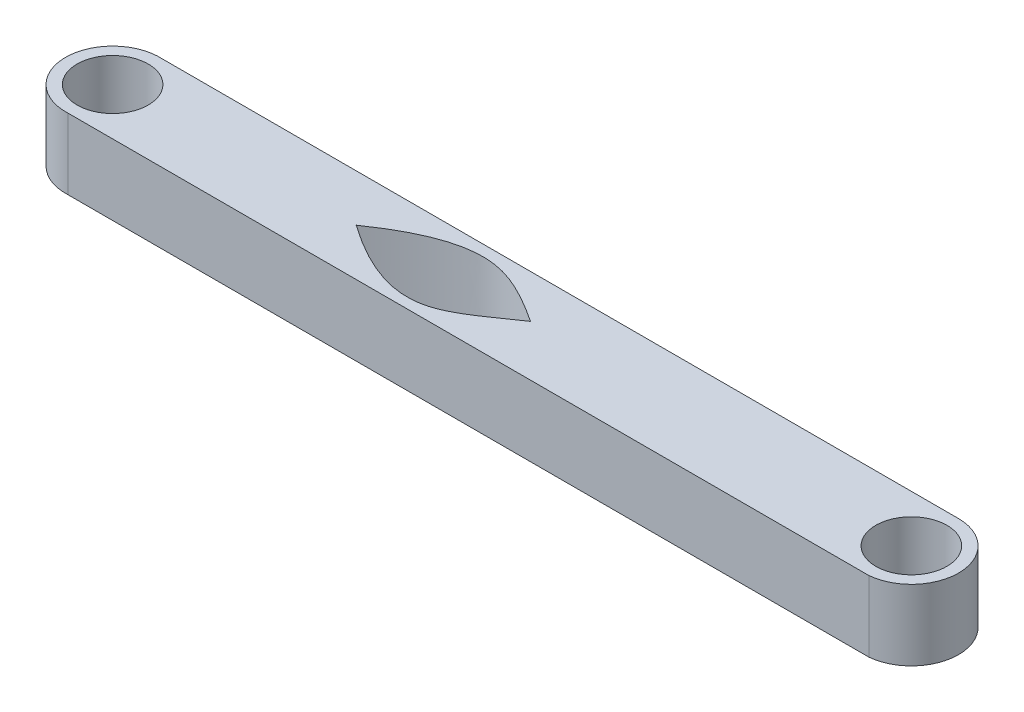
ISO-10303-21;
HEADER;
FILE_DESCRIPTION(('STEP AP214'),'2;1');
FILE_NAME('part.step','',(''),(''),'','','');
FILE_SCHEMA(('AUTOMOTIVE_DESIGN { 1 0 10303 214 1 1 1 1 }'));
ENDSEC;
DATA;
#1=APPLICATION_CONTEXT('core data for automotive mechanical design processes');
#2=APPLICATION_PROTOCOL_DEFINITION('international standard','automotive_design',2000,#1);
#3=PRODUCT_CONTEXT('',#1,'mechanical');
#4=PRODUCT('Part','Part','',(#3));
#5=PRODUCT_RELATED_PRODUCT_CATEGORY('part','',(#4));
#6=PRODUCT_DEFINITION_FORMATION('','',#4);
#7=PRODUCT_DEFINITION_CONTEXT('part definition',#1,'design');
#8=PRODUCT_DEFINITION('design','',#6,#7);
#9=PRODUCT_DEFINITION_SHAPE('','',#8);
#10=(LENGTH_UNIT() NAMED_UNIT(*) SI_UNIT(.MILLI.,.METRE.));
#11=(NAMED_UNIT(*) PLANE_ANGLE_UNIT() SI_UNIT($,.RADIAN.));
#12=(NAMED_UNIT(*) SI_UNIT($,.STERADIAN.) SOLID_ANGLE_UNIT());
#13=UNCERTAINTY_MEASURE_WITH_UNIT(LENGTH_MEASURE(1.E-05),#10,'distance_accuracy_value','');
#14=(GEOMETRIC_REPRESENTATION_CONTEXT(3) GLOBAL_UNCERTAINTY_ASSIGNED_CONTEXT((#13)) GLOBAL_UNIT_ASSIGNED_CONTEXT((#10,
#11,#12)) REPRESENTATION_CONTEXT('',''));
#15=CARTESIAN_POINT('',(0.,0.,0.));
#16=DIRECTION('',(0.,0.,1.));
#17=DIRECTION('',(1.,0.,0.));
#18=AXIS2_PLACEMENT_3D('',#15,#16,#17);
#19=CARTESIAN_POINT('',(0.,38.1,0.));
#20=DIRECTION('',(0.,1.,0.));
#21=DIRECTION('',(0.,0.,1.));
#22=AXIS2_PLACEMENT_3D('',#19,#20,#21);
#23=PLANE('',#22);
#24=CARTESIAN_POINT('',(367.322364583333,38.1,-25.3057257683215));
#25=DIRECTION('',(0.,1.,0.));
#26=DIRECTION('',(0.,0.,1.));
#27=AXIS2_PLACEMENT_3D('',#24,#25,#26);
#28=CIRCLE('',#27,19.177);
#29=CARTESIAN_POINT('',(367.322364583333,38.1,-6.12872576832152));
#30=VERTEX_POINT('',#29);
#31=EDGE_CURVE('E175',#30,#30,#28,.T.);
#32=ORIENTED_EDGE('',*,*,#31,.F.);
#33=EDGE_LOOP('',(#32));
#34=FACE_BOUND('',#33,.T.);
#35=CARTESIAN_POINT('',(-63.21821875,38.1,-25.36825));
#36=DIRECTION('',(0.,1.,0.));
#37=DIRECTION('',(0.,0.,1.));
#38=AXIS2_PLACEMENT_3D('',#35,#36,#37);
#39=CIRCLE('',#38,19.177);
#40=CARTESIAN_POINT('',(-63.21821875,38.1,-6.19124999999999));
#41=VERTEX_POINT('',#40);
#42=EDGE_CURVE('E107',#41,#41,#39,.T.);
#43=ORIENTED_EDGE('',*,*,#42,.F.);
#44=EDGE_LOOP('',(#43));
#45=FACE_BOUND('',#44,.T.);
#46=CARTESIAN_POINT('',(367.322364583333,38.1,-25.3057257683215));
#47=DIRECTION('',(0.,1.,0.));
#48=DIRECTION('',(0.,0.,1.));
#49=AXIS2_PLACEMENT_3D('',#46,#47,#48);
#50=CIRCLE('',#49,25.4307742316785);
#51=CARTESIAN_POINT('',(367.322364583333,38.1,-50.7365));
#52=VERTEX_POINT('',#51);
#53=CARTESIAN_POINT('',(369.841197916667,38.1,0.));
#54=VERTEX_POINT('',#53);
#55=EDGE_CURVE('E158',#52,#54,#50,.F.);
#56=ORIENTED_EDGE('',*,*,#55,.F.);
#57=DIRECTION('',(1.,0.,0.));
#58=VECTOR('',#57,1.);
#59=CARTESIAN_POINT('',(0.,38.1,-50.7365));
#60=LINE('',#59,#58);
#61=CARTESIAN_POINT('',(-64.4776354166665,38.1,-50.7365));
#62=VERTEX_POINT('',#61);
#63=EDGE_CURVE('E188',#62,#52,#60,.T.);
#64=ORIENTED_EDGE('',*,*,#63,.F.);
#65=CARTESIAN_POINT('',(-63.21821875,38.1,-25.36825));
#66=DIRECTION('',(0.,1.,0.));
#67=DIRECTION('',(0.,0.,1.));
#68=AXIS2_PLACEMENT_3D('',#65,#66,#67);
#69=CIRCLE('',#68,25.399492876882);
#70=CARTESIAN_POINT('',(-61.9588020833333,38.1,0.));
#71=VERTEX_POINT('',#70);
#72=EDGE_CURVE('E193',#71,#62,#69,.F.);
#73=ORIENTED_EDGE('',*,*,#72,.F.);
#74=DIRECTION('',(1.,0.,0.));
#75=VECTOR('',#74,1.);
#76=CARTESIAN_POINT('',(0.,38.1,0.));
#77=LINE('',#76,#75);
#78=EDGE_CURVE('E165',#71,#54,#77,.T.);
#79=ORIENTED_EDGE('',*,*,#78,.T.);
#80=EDGE_LOOP('',(#56,#64,#73,#79));
#81=FACE_BOUND('',#80,.T.);
#82=CARTESIAN_POINT('',(0.,38.1,-25.36825));
#83=CARTESIAN_POINT('',(25.5963958252859,38.1,-61.5196106479018));
#84=CARTESIAN_POINT('',(58.6773186494475,38.1,-27.3726781510493));
#85=CARTESIAN_POINT('',(118.362782549493,38.1,4.35583137095098));
#86=CARTESIAN_POINT('',(170.473666471598,38.1,-37.801487315961));
#87=CARTESIAN_POINT('',(214.204958372177,38.1,-57.3627297547905));
#88=CARTESIAN_POINT('',(239.392678616694,38.1,-25.36825));
#89=B_SPLINE_CURVE_WITH_KNOTS('',3,(#82,#83,#84,#85,#86,#87,#88),.UNSPECIFIED.,.F.,.F.,(4,1,1,1,
4),(0.,0.293535528476679,0.509769313424357,0.658147643170667,1.),.UNSPECIFIED.);
#90=CARTESIAN_POINT('',(68.0533826437842,38.1,-25.368249998166));
#91=VERTEX_POINT('',#90);
#92=CARTESIAN_POINT('',(159.945271560049,38.1,-27.422727744916));
#93=VERTEX_POINT('',#92);
#94=EDGE_CURVE('E100',#91,#93,#89,.T.);
#95=ORIENTED_EDGE('',*,*,#94,.F.);
#96=CARTESIAN_POINT('',(0.,38.1,-25.36825));
#97=CARTESIAN_POINT('',(25.3351872059456,38.1,11.2056176959292));
#98=CARTESIAN_POINT('',(59.2664813672699,38.1,-24.3167972957163));
#99=CARTESIAN_POINT('',(147.333316585039,38.1,-68.3318332741785));
#100=CARTESIAN_POINT('',(200.091851187685,38.1,25.9181581188524));
#101=CARTESIAN_POINT('',(239.392678616694,38.1,-25.36825));
#102=B_SPLINE_CURVE_WITH_KNOTS('',3,(#96,#97,#98,#99,#100,#101),.UNSPECIFIED.,.F.,.F.,(4,1,1,4),
(0.,0.293668056423848,0.509999468462109,1.),.UNSPECIFIED.);
#103=EDGE_CURVE('E53',#91,#93,#102,.T.);
#104=ORIENTED_EDGE('',*,*,#103,.T.);
#105=EDGE_LOOP('',(#95,#104));
#106=FACE_BOUND('',#105,.T.);
#107=ADVANCED_FACE('F36',(#34,#45,#81,#106),#23,.T.);
#108=CARTESIAN_POINT('',(0.,0.,0.));
#109=DIRECTION('',(0.,1.,0.));
#110=DIRECTION('',(0.,0.,1.));
#111=AXIS2_PLACEMENT_3D('',#108,#109,#110);
#112=PLANE('',#111);
#113=CARTESIAN_POINT('',(367.322364583333,0.,-25.3057257683215));
#114=DIRECTION('',(0.,1.,0.));
#115=DIRECTION('',(0.,0.,1.));
#116=AXIS2_PLACEMENT_3D('',#113,#114,#115);
#117=CIRCLE('',#116,19.177);
#118=CARTESIAN_POINT('',(367.322364583333,0.,-6.12872576832152));
#119=VERTEX_POINT('',#118);
#120=EDGE_CURVE('E40',#119,#119,#117,.T.);
#121=ORIENTED_EDGE('',*,*,#120,.T.);
#122=EDGE_LOOP('',(#121));
#123=FACE_BOUND('',#122,.T.);
#124=CARTESIAN_POINT('',(-63.21821875,0.,-25.36825));
#125=DIRECTION('',(0.,1.,0.));
#126=DIRECTION('',(0.,0.,1.));
#127=AXIS2_PLACEMENT_3D('',#124,#125,#126);
#128=CIRCLE('',#127,19.177);
#129=CARTESIAN_POINT('',(-63.21821875,0.,-6.19124999999999));
#130=VERTEX_POINT('',#129);
#131=EDGE_CURVE('E167',#130,#130,#128,.T.);
#132=ORIENTED_EDGE('',*,*,#131,.T.);
#133=EDGE_LOOP('',(#132));
#134=FACE_BOUND('',#133,.T.);
#135=CARTESIAN_POINT('',(367.322364583333,0.,-25.3057257683215));
#136=DIRECTION('',(0.,1.,0.));
#137=DIRECTION('',(0.,0.,1.));
#138=AXIS2_PLACEMENT_3D('',#135,#136,#137);
#139=CIRCLE('',#138,25.4307742316785);
#140=CARTESIAN_POINT('',(367.322364583333,0.,-50.7365));
#141=VERTEX_POINT('',#140);
#142=CARTESIAN_POINT('',(369.841197916667,0.,0.));
#143=VERTEX_POINT('',#142);
#144=EDGE_CURVE('E151',#141,#143,#139,.F.);
#145=ORIENTED_EDGE('',*,*,#144,.T.);
#146=DIRECTION('',(1.,0.,0.));
#147=VECTOR('',#146,1.);
#148=CARTESIAN_POINT('',(0.,0.,0.));
#149=LINE('',#148,#147);
#150=CARTESIAN_POINT('',(-61.9588020833333,0.,0.));
#151=VERTEX_POINT('',#150);
#152=EDGE_CURVE('E156',#151,#143,#149,.T.);
#153=ORIENTED_EDGE('',*,*,#152,.F.);
#154=CARTESIAN_POINT('',(-63.21821875,0.,-25.36825));
#155=DIRECTION('',(0.,1.,0.));
#156=DIRECTION('',(0.,0.,1.));
#157=AXIS2_PLACEMENT_3D('',#154,#155,#156);
#158=CIRCLE('',#157,25.399492876882);
#159=CARTESIAN_POINT('',(-64.4776354166665,0.,-50.7365));
#160=VERTEX_POINT('',#159);
#161=EDGE_CURVE('E150',#151,#160,#158,.F.);
#162=ORIENTED_EDGE('',*,*,#161,.T.);
#163=DIRECTION('',(1.,0.,0.));
#164=VECTOR('',#163,1.);
#165=CARTESIAN_POINT('',(0.,0.,-50.7365));
#166=LINE('',#165,#164);
#167=EDGE_CURVE('E143',#160,#141,#166,.T.);
#168=ORIENTED_EDGE('',*,*,#167,.T.);
#169=EDGE_LOOP('',(#145,#153,#162,#168));
#170=FACE_BOUND('',#169,.T.);
#171=CARTESIAN_POINT('',(0.,0.,-25.36825));
#172=CARTESIAN_POINT('',(25.3351872059456,0.,11.2056176959292));
#173=CARTESIAN_POINT('',(59.2664813672699,0.,-24.3167972957163));
#174=CARTESIAN_POINT('',(147.333316585039,0.,-68.3318332741785));
#175=CARTESIAN_POINT('',(200.091851187685,0.,25.9181581188524));
#176=CARTESIAN_POINT('',(239.392678616694,0.,-25.36825));
#177=B_SPLINE_CURVE_WITH_KNOTS('',3,(#171,#172,#173,#174,#175,#176),.UNSPECIFIED.,.F.,.F.,(4,1,
1,4),(0.,0.293668056423848,0.509999468462109,1.),.UNSPECIFIED.);
#178=CARTESIAN_POINT('',(68.05338264378,0.,-25.368249998169));
#179=VERTEX_POINT('',#178);
#180=CARTESIAN_POINT('',(159.945271560048,0.,-27.4227277449154));
#181=VERTEX_POINT('',#180);
#182=EDGE_CURVE('E91',#179,#181,#177,.T.);
#183=ORIENTED_EDGE('',*,*,#182,.F.);
#184=CARTESIAN_POINT('',(0.,0.,-25.36825));
#185=CARTESIAN_POINT('',(25.5963958252859,0.,-61.5196106479018));
#186=CARTESIAN_POINT('',(58.6773186494475,0.,-27.3726781510493));
#187=CARTESIAN_POINT('',(118.362782549493,0.,4.35583137095098));
#188=CARTESIAN_POINT('',(170.473666471598,0.,-37.801487315961));
#189=CARTESIAN_POINT('',(214.204958372177,0.,-57.3627297547905));
#190=CARTESIAN_POINT('',(239.392678616694,0.,-25.36825));
#191=B_SPLINE_CURVE_WITH_KNOTS('',3,(#184,#185,#186,#187,#188,#189,#190),.UNSPECIFIED.,.F.,.F.,
(4,1,1,1,4),(0.,0.293535528476679,0.509769313424357,0.658147643170667,1.),.UNSPECIFIED.);
#192=EDGE_CURVE('E94',#179,#181,#191,.T.);
#193=ORIENTED_EDGE('',*,*,#192,.T.);
#194=EDGE_LOOP('',(#183,#193));
#195=FACE_BOUND('',#194,.T.);
#196=ADVANCED_FACE('F99',(#123,#134,#170,#195),#112,.F.);
#197=CARTESIAN_POINT('',(367.322364583333,38.1,-25.3057257683215));
#198=DIRECTION('',(0.,-1.,0.));
#199=DIRECTION('',(0.,0.,-1.));
#200=AXIS2_PLACEMENT_3D('',#197,#198,#199);
#201=CYLINDRICAL_SURFACE('',#200,25.4307742316785);
#202=ORIENTED_EDGE('',*,*,#144,.F.);
#203=DIRECTION('',(0.,-1.,0.));
#204=VECTOR('',#203,1.);
#205=CARTESIAN_POINT('',(367.322364583333,38.1,-50.7365));
#206=LINE('',#205,#204);
#207=EDGE_CURVE('E12',#52,#141,#206,.T.);
#208=ORIENTED_EDGE('',*,*,#207,.F.);
#209=ORIENTED_EDGE('',*,*,#55,.T.);
#210=DIRECTION('',(0.,-1.,0.));
#211=VECTOR('',#210,1.);
#212=CARTESIAN_POINT('',(369.841197916667,38.1,0.));
#213=LINE('',#212,#211);
#214=EDGE_CURVE('E162',#54,#143,#213,.T.);
#215=ORIENTED_EDGE('',*,*,#214,.T.);
#216=EDGE_LOOP('',(#202,#208,#209,#215));
#217=FACE_BOUND('',#216,.T.);
#218=ADVANCED_FACE('F38',(#217),#201,.T.);
#219=CARTESIAN_POINT('',(0.,38.1,-50.7365));
#220=DIRECTION('',(0.,0.,-1.));
#221=DIRECTION('',(-1.,0.,0.));
#222=AXIS2_PLACEMENT_3D('',#219,#220,#221);
#223=PLANE('',#222);
#224=ORIENTED_EDGE('',*,*,#167,.F.);
#225=DIRECTION('',(0.,-1.,0.));
#226=VECTOR('',#225,1.);
#227=CARTESIAN_POINT('',(-64.4776354166665,38.1,-50.7365));
#228=LINE('',#227,#226);
#229=EDGE_CURVE('E45',#62,#160,#228,.T.);
#230=ORIENTED_EDGE('',*,*,#229,.F.);
#231=ORIENTED_EDGE('',*,*,#63,.T.);
#232=ORIENTED_EDGE('',*,*,#207,.T.);
#233=EDGE_LOOP('',(#224,#230,#231,#232));
#234=FACE_BOUND('',#233,.T.);
#235=ADVANCED_FACE('F133',(#234),#223,.T.);
#236=CARTESIAN_POINT('',(-63.21821875,38.1,-25.36825));
#237=DIRECTION('',(0.,-1.,0.));
#238=DIRECTION('',(0.,0.,-1.));
#239=AXIS2_PLACEMENT_3D('',#236,#237,#238);
#240=CYLINDRICAL_SURFACE('',#239,25.399492876882);
#241=ORIENTED_EDGE('',*,*,#161,.F.);
#242=DIRECTION('',(0.,-1.,0.));
#243=VECTOR('',#242,1.);
#244=CARTESIAN_POINT('',(-61.9588020833333,38.1,0.));
#245=LINE('',#244,#243);
#246=EDGE_CURVE('E164',#71,#151,#245,.T.);
#247=ORIENTED_EDGE('',*,*,#246,.F.);
#248=ORIENTED_EDGE('',*,*,#72,.T.);
#249=ORIENTED_EDGE('',*,*,#229,.T.);
#250=EDGE_LOOP('',(#241,#247,#248,#249));
#251=FACE_BOUND('',#250,.T.);
#252=ADVANCED_FACE('F130',(#251),#240,.T.);
#253=CARTESIAN_POINT('',(0.,38.1,0.));
#254=DIRECTION('',(0.,0.,-1.));
#255=DIRECTION('',(-1.,0.,0.));
#256=AXIS2_PLACEMENT_3D('',#253,#254,#255);
#257=PLANE('',#256);
#258=ORIENTED_EDGE('',*,*,#152,.T.);
#259=ORIENTED_EDGE('',*,*,#214,.F.);
#260=ORIENTED_EDGE('',*,*,#78,.F.);
#261=ORIENTED_EDGE('',*,*,#246,.T.);
#262=EDGE_LOOP('',(#258,#259,#260,#261));
#263=FACE_BOUND('',#262,.T.);
#264=ADVANCED_FACE('F120',(#263),#257,.F.);
#265=DIRECTION('',(0.,1.,0.));
#266=VECTOR('',#265,1.);
#267=SURFACE_OF_LINEAR_EXTRUSION('',#177,#266);
#268=ORIENTED_EDGE('',*,*,#103,.F.);
#269=DIRECTION('',(0.,1.,0.));
#270=VECTOR('',#269,1.);
#271=CARTESIAN_POINT('',(68.05338264378,0.,-25.368249998169));
#272=LINE('',#271,#270);
#273=EDGE_CURVE('E88',#179,#91,#272,.T.);
#274=ORIENTED_EDGE('',*,*,#273,.F.);
#275=ORIENTED_EDGE('',*,*,#182,.T.);
#276=DIRECTION('',(0.,1.,0.));
#277=VECTOR('',#276,1.);
#278=CARTESIAN_POINT('',(159.945271560049,0.,-27.422727744916));
#279=LINE('',#278,#277);
#280=EDGE_CURVE('E60',#181,#93,#279,.T.);
#281=ORIENTED_EDGE('',*,*,#280,.T.);
#282=EDGE_LOOP('',(#268,#274,#275,#281));
#283=FACE_BOUND('',#282,.T.);
#284=ADVANCED_FACE('F89',(#283),#267,.T.);
#285=DIRECTION('',(0.,1.,0.));
#286=VECTOR('',#285,1.);
#287=SURFACE_OF_LINEAR_EXTRUSION('',#191,#286);
#288=ORIENTED_EDGE('',*,*,#94,.T.);
#289=ORIENTED_EDGE('',*,*,#280,.F.);
#290=ORIENTED_EDGE('',*,*,#192,.F.);
#291=ORIENTED_EDGE('',*,*,#273,.T.);
#292=EDGE_LOOP('',(#288,#289,#290,#291));
#293=FACE_BOUND('',#292,.T.);
#294=ADVANCED_FACE('F96',(#293),#287,.F.);
#295=CARTESIAN_POINT('',(-63.21821875,-12.7,-25.36825));
#296=DIRECTION('',(0.,1.,0.));
#297=DIRECTION('',(0.,0.,1.));
#298=AXIS2_PLACEMENT_3D('',#295,#296,#297);
#299=CYLINDRICAL_SURFACE('',#298,19.177);
#300=ORIENTED_EDGE('',*,*,#42,.T.);
#301=EDGE_LOOP('',(#300));
#302=FACE_BOUND('',#301,.T.);
#303=ORIENTED_EDGE('',*,*,#131,.F.);
#304=EDGE_LOOP('',(#303));
#305=FACE_BOUND('',#304,.T.);
#306=ADVANCED_FACE('F209',(#302,#305),#299,.F.);
#307=CARTESIAN_POINT('',(367.322364583333,-12.7,-25.3057257683215));
#308=DIRECTION('',(0.,1.,0.));
#309=DIRECTION('',(0.,0.,1.));
#310=AXIS2_PLACEMENT_3D('',#307,#308,#309);
#311=CYLINDRICAL_SURFACE('',#310,19.177);
#312=ORIENTED_EDGE('',*,*,#31,.T.);
#313=EDGE_LOOP('',(#312));
#314=FACE_BOUND('',#313,.T.);
#315=ORIENTED_EDGE('',*,*,#120,.F.);
#316=EDGE_LOOP('',(#315));
#317=FACE_BOUND('',#316,.T.);
#318=ADVANCED_FACE('F180',(#314,#317),#311,.F.);
#319=CLOSED_SHELL('',(#107,#196,#218,#235,#252,#264,#284,#294,#306,#318));
#320=MANIFOLD_SOLID_BREP('B2',#319);
#321=ADVANCED_BREP_SHAPE_REPRESENTATION('',(#18,#320),#14);
#322=SHAPE_DEFINITION_REPRESENTATION(#9,#321);
ENDSEC;
END-ISO-10303-21;
